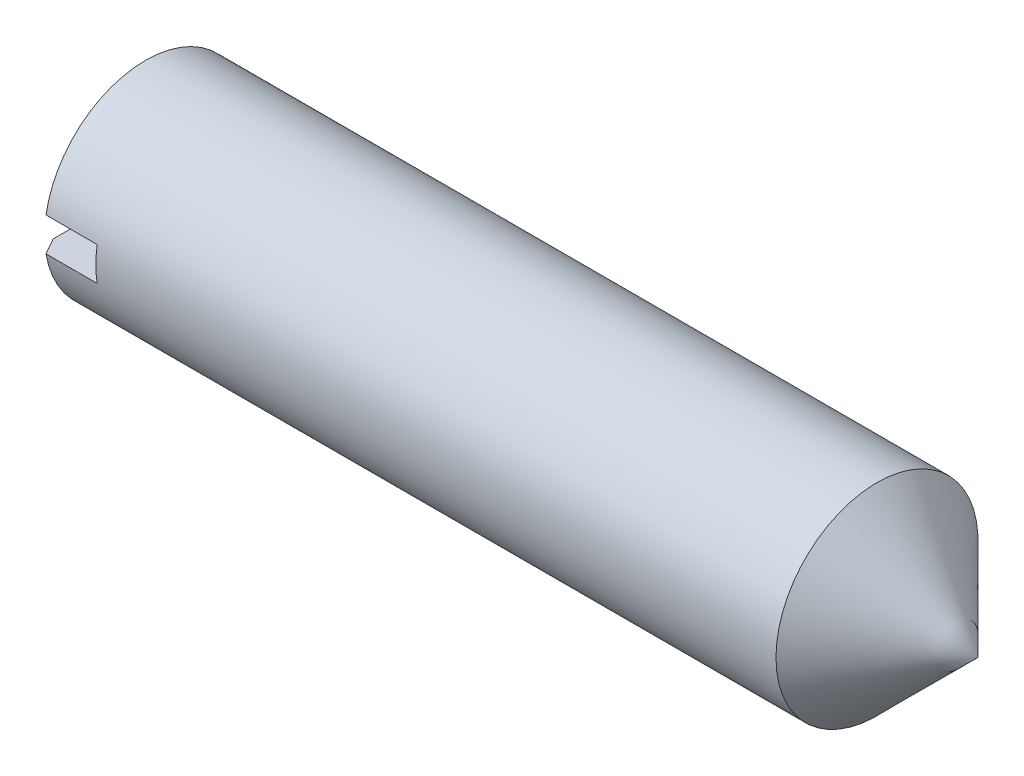
ISO-10303-21;
HEADER;
FILE_DESCRIPTION(('STEP AP214'),'2;1');
FILE_NAME('part.step','',(''),(''),'','','');
FILE_SCHEMA(('AUTOMOTIVE_DESIGN { 1 0 10303 214 1 1 1 1 }'));
ENDSEC;
DATA;
#1=APPLICATION_CONTEXT('core data for automotive mechanical design processes');
#2=APPLICATION_PROTOCOL_DEFINITION('international standard','automotive_design',2000,#1);
#3=PRODUCT_CONTEXT('',#1,'mechanical');
#4=PRODUCT('Part','Part','',(#3));
#5=PRODUCT_RELATED_PRODUCT_CATEGORY('part','',(#4));
#6=PRODUCT_DEFINITION_FORMATION('','',#4);
#7=PRODUCT_DEFINITION_CONTEXT('part definition',#1,'design');
#8=PRODUCT_DEFINITION('design','',#6,#7);
#9=PRODUCT_DEFINITION_SHAPE('','',#8);
#10=(LENGTH_UNIT() NAMED_UNIT(*) SI_UNIT(.MILLI.,.METRE.));
#11=(NAMED_UNIT(*) PLANE_ANGLE_UNIT() SI_UNIT($,.RADIAN.));
#12=(NAMED_UNIT(*) SI_UNIT($,.STERADIAN.) SOLID_ANGLE_UNIT());
#13=UNCERTAINTY_MEASURE_WITH_UNIT(LENGTH_MEASURE(1.E-05),#10,'distance_accuracy_value','');
#14=(GEOMETRIC_REPRESENTATION_CONTEXT(3) GLOBAL_UNCERTAINTY_ASSIGNED_CONTEXT((#13)) GLOBAL_UNIT_ASSIGNED_CONTEXT((#10,
#11,#12)) REPRESENTATION_CONTEXT('',''));
#15=CARTESIAN_POINT('',(0.,0.,0.));
#16=DIRECTION('',(0.,0.,1.));
#17=DIRECTION('',(1.,0.,0.));
#18=AXIS2_PLACEMENT_3D('',#15,#16,#17);
#19=CARTESIAN_POINT('',(0.,0.,0.));
#20=DIRECTION('',(-1.,0.,0.));
#21=DIRECTION('',(0.,0.,1.));
#22=AXIS2_PLACEMENT_3D('',#19,#20,#21);
#23=PLANE('',#22);
#24=CARTESIAN_POINT('',(0.,0.,0.));
#25=DIRECTION('',(-1.,0.,0.));
#26=DIRECTION('',(0.,0.,1.));
#27=AXIS2_PLACEMENT_3D('',#24,#25,#26);
#28=CIRCLE('',#27,5.036);
#29=CARTESIAN_POINT('',(0.,-1.,-4.93571636138058));
#30=VERTEX_POINT('',#29);
#31=CARTESIAN_POINT('',(0.,-0.999999999999999,4.93571636138058));
#32=VERTEX_POINT('',#31);
#33=EDGE_CURVE('E160',#30,#32,#28,.T.);
#34=ORIENTED_EDGE('',*,*,#33,.T.);
#35=DIRECTION('',(0.,0.,-1.));
#36=VECTOR('',#35,1.);
#37=CARTESIAN_POINT('',(0.,-0.999999999999999,6.));
#38=LINE('',#37,#36);
#39=EDGE_CURVE('E114',#32,#30,#38,.T.);
#40=ORIENTED_EDGE('',*,*,#39,.T.);
#41=EDGE_LOOP('',(#34,#40));
#42=FACE_BOUND('',#41,.T.);
#43=ADVANCED_FACE('F35',(#42),#23,.T.);
#44=CARTESIAN_POINT('',(0.,0.,0.));
#45=DIRECTION('',(1.,0.,0.));
#46=DIRECTION('',(0.,0.,-1.));
#47=AXIS2_PLACEMENT_3D('',#44,#45,#46);
#48=CONICAL_SURFACE('',#47,5.036,1.04719755119663);
#49=CARTESIAN_POINT('',(0.556565659498765,0.,0.));
#50=DIRECTION('',(-1.,0.,0.));
#51=DIRECTION('',(0.,0.,1.));
#52=AXIS2_PLACEMENT_3D('',#49,#50,#51);
#53=CIRCLE('',#52,6.);
#54=CARTESIAN_POINT('',(0.556565659498765,-1.,-5.91607978309962));
#55=VERTEX_POINT('',#54);
#56=CARTESIAN_POINT('',(0.556565659498765,-0.999999999999999,5.91607978309962));
#57=VERTEX_POINT('',#56);
#58=EDGE_CURVE('E165',#55,#57,#53,.T.);
#59=ORIENTED_EDGE('',*,*,#58,.T.);
#60=CARTESIAN_POINT('',(4.73989669271483,-0.999999999999998,13.2079399731122));
#61=CARTESIAN_POINT('',(4.41853771720244,-0.999999999999998,12.649708210717));
#62=CARTESIAN_POINT('',(4.09724308620707,-0.999999999999999,12.0914392943507));
#63=CARTESIAN_POINT('',(3.4549186683915,-0.999999999999999,10.9747439104665));
#64=CARTESIAN_POINT('',(3.13388888345024,-0.999999999999999,10.4163174418678));
#65=CARTESIAN_POINT('',(2.49197762047842,-0.999999999999999,9.29878375972739));
#66=CARTESIAN_POINT('',(2.17109646770033,-0.999999999999999,8.73967635935292));
#67=CARTESIAN_POINT('',(1.5300275923409,-0.999999999999999,7.62106803973439));
#68=CARTESIAN_POINT('',(1.20983986573005,-0.999999999999999,7.06156712280223));
#69=CARTESIAN_POINT('',(0.731752999683646,-0.999999999999999,6.22374471344308));
#70=CARTESIAN_POINT('',(0.573331144759489,-0.999999999999999,5.94572157695904));
#71=CARTESIAN_POINT('',(0.257006805730443,-0.999999999999999,5.38937510077954));
#72=CARTESIAN_POINT('',(0.0991043281518022,-0.999999999999999,5.11105175736974));
#73=CARTESIAN_POINT('',(-0.215803871687391,-0.999999999999999,4.55405780901709));
#74=CARTESIAN_POINT('',(-0.372809954009694,-0.999999999999999,4.27538740768412));
#75=CARTESIAN_POINT('',(-0.685421411461987,-0.999999999999999,3.71727146951171));
#76=CARTESIAN_POINT('',(-0.841026834596689,-1.,3.43782595967023));
#77=CARTESIAN_POINT('',(-1.07280047051857,-1.,3.01670739395931));
#78=CARTESIAN_POINT('',(-1.15000341162115,-1.,2.87560489491669));
#79=CARTESIAN_POINT('',(-1.30334590311718,-1.,2.59280771309016));
#80=CARTESIAN_POINT('',(-1.37948536629294,-1.,2.45111298296012));
#81=CARTESIAN_POINT('',(-1.53019389021686,-1.,2.16666998975977));
#82=CARTESIAN_POINT('',(-1.60476099220117,-0.999999999999999,2.02392068095096));
#83=CARTESIAN_POINT('',(-1.71445658720684,-1.,1.80870871103214));
#84=CARTESIAN_POINT('',(-1.75066016319061,-1.,1.73679509885007));
#85=CARTESIAN_POINT('',(-1.82208482318114,-1.,1.59248261773203));
#86=CARTESIAN_POINT('',(-1.85730593731415,-1.,1.52008376376016));
#87=CARTESIAN_POINT('',(-1.92735529771608,-1.,1.37261463948839));
#88=CARTESIAN_POINT('',(-1.96214530553783,-1.,1.29752611216615));
#89=CARTESIAN_POINT('',(-2.02965956084307,-1.,1.14642727351844));
#90=CARTESIAN_POINT('',(-2.06238404828155,-1.,1.07041707049315));
#91=CARTESIAN_POINT('',(-2.12476431844618,-1.,0.917145557122222));
#92=CARTESIAN_POINT('',(-2.15442052211011,-1.,0.839884420078598));
#93=CARTESIAN_POINT('',(-2.20906255805527,-1.,0.683706866903888));
#94=CARTESIAN_POINT('',(-2.23405029456052,-1.,0.604791140337526));
#95=CARTESIAN_POINT('',(-2.27018581045352,-1.,0.470093422561839));
#96=CARTESIAN_POINT('',(-2.28321589300996,-1.,0.414824677608005));
#97=CARTESIAN_POINT('',(-2.3049462303462,-1.,0.303453047162208));
#98=CARTESIAN_POINT('',(-2.31364920633167,-1.,0.247350708818641));
#99=CARTESIAN_POINT('',(-2.32581520982486,-1.,0.13495705990007));
#100=CARTESIAN_POINT('',(-2.32931440889467,-1.,0.0786698056186482));
#101=CARTESIAN_POINT('',(-2.33076867881164,-1.,-0.0339758725520376));
#102=CARTESIAN_POINT('',(-2.32872385654246,-1.,-0.090334295048305));
#103=CARTESIAN_POINT('',(-2.3180579912098,-1.,-0.217768647723007));
#104=CARTESIAN_POINT('',(-2.3078092184783,-1.,-0.288706275864568));
#105=CARTESIAN_POINT('',(-2.280414489516,-1.,-0.429255862703966));
#106=CARTESIAN_POINT('',(-2.2632604858775,-1.,-0.49886617505618));
#107=CARTESIAN_POINT('',(-2.2336732423078,-1.,-0.602653040473396));
#108=CARTESIAN_POINT('',(-2.22308279162327,-1.,-0.637377371820186));
#109=CARTESIAN_POINT('',(-2.20083833270244,-1.,-0.706460987270025));
#110=CARTESIAN_POINT('',(-2.18918499575322,-1.,-0.740820486688082));
#111=CARTESIAN_POINT('',(-2.16499431488904,-1.,-0.809218732225817));
#112=CARTESIAN_POINT('',(-2.15245710212568,-1.,-0.84325752508653));
#113=CARTESIAN_POINT('',(-2.1266433301133,-1.,-0.91105862463122));
#114=CARTESIAN_POINT('',(-2.11336665637896,-1.,-0.944820887568746));
#115=CARTESIAN_POINT('',(-2.06998388355674,-1.,-1.05227293315393));
#116=CARTESIAN_POINT('',(-2.03871498859511,-1.,-1.12549298780915));
#117=CARTESIAN_POINT('',(-1.97418773021559,-1.,-1.27105481935724));
#118=CARTESIAN_POINT('',(-1.94092900538411,-1.,-1.34339643381073));
#119=CARTESIAN_POINT('',(-1.87300145739127,-1.,-1.48745172367406));
#120=CARTESIAN_POINT('',(-1.83833201130238,-1.,-1.55916510431244));
#121=CARTESIAN_POINT('',(-1.76798292469884,-1.,-1.70209571429685));
#122=CARTESIAN_POINT('',(-1.73230324722167,-1.,-1.77331292536984));
#123=CARTESIAN_POINT('',(-1.62404833166045,-1.,-1.98662313537005));
#124=CARTESIAN_POINT('',(-1.55036430564616,-1.,-2.12815237228352));
#125=CARTESIAN_POINT('',(-1.40130813476099,-1.,-2.41025810099429));
#126=CARTESIAN_POINT('',(-1.32593649693932,-1.,-2.55083486286056));
#127=CARTESIAN_POINT('',(-1.17450983157065,-1.,-2.83063597104794));
#128=CARTESIAN_POINT('',(-1.09846071331473,-1.,-2.9698635188263));
#129=CARTESIAN_POINT('',(-0.945628453570271,-1.,-3.24792809661776));
#130=CARTESIAN_POINT('',(-0.868845256726566,-1.,-3.3867650961424));
#131=CARTESIAN_POINT('',(-0.637891315015069,-1.,-3.80258527592336));
#132=CARTESIAN_POINT('',(-0.482967580837516,-1.,-4.07914988721106));
#133=CARTESIAN_POINT('',(-0.119566497031354,-1.,-4.72494312842936));
#134=CARTESIAN_POINT('',(0.0893330443982409,-1.,-5.09393352806221));
#135=CARTESIAN_POINT('',(0.508131169896265,-1.,-5.83135176267693));
#136=CARTESIAN_POINT('',(0.718029765116063,-1.,-6.19977959131851));
#137=CARTESIAN_POINT('',(1.13850339248353,-1.,-6.93645171703563));
#138=CARTESIAN_POINT('',(1.34907866934877,-1.,-7.30469587435077));
#139=CARTESIAN_POINT('',(1.770602232516,-1.,-8.04096877388174));
#140=CARTESIAN_POINT('',(1.98155051744594,-1.,-8.40899751688335));
#141=CARTESIAN_POINT('',(2.40459995529787,-1.,-9.14648067015203));
#142=CARTESIAN_POINT('',(2.61670218630784,-1.,-9.51593446186714));
#143=CARTESIAN_POINT('',(3.04108596616447,-1.,-10.2547396320326));
#144=CARTESIAN_POINT('',(3.2533675152308,-1.,-10.6240910103568));
#145=CARTESIAN_POINT('',(3.67796813526833,-1.,-11.3625576054534));
#146=CARTESIAN_POINT('',(3.89028714937822,-1.,-11.7316728549228));
#147=CARTESIAN_POINT('',(4.31502474467967,-1.,-12.469845406271));
#148=CARTESIAN_POINT('',(4.52744332573721,-1.,-12.8389027082269));
#149=CARTESIAN_POINT('',(4.73989669271483,-1.,-13.2079399731122));
#150=B_SPLINE_CURVE_WITH_KNOTS('',3,(#60,#61,#62,#63,#64,#65,#66,#67,#68,#69,#70,#71,#72,#73,
#74,#75,#76,#77,#78,#79,#80,#81,#82,#83,#84,#85,#86,#87,#88,#89,#90,#91,#92,#93,#94,#95,#96,#97,
#98,#99,#100,#101,#102,#103,#104,#105,#106,#107,#108,#109,#110,#111,#112,#113,#114,#115,#116,
#117,#118,#119,#120,#121,#122,#123,#124,#125,#126,#127,#128,#129,#130,#131,#132,#133,#134,#135,
#136,#137,#138,#139,#140,#141,#142,#143,#144,#145,#146,#147,#148,#149),.UNSPECIFIED.,.F.,.F.,(4,
2,2,2,2,2,2,2,2,2,2,2,2,2,2,2,2,2,2,2,2,2,2,2,2,2,2,2,2,2,2,2,2,2,2,2,2,2,2,2,2,2,2,2,4),(0.,
1.93236881448588,3.86475122217014,5.79868288382638,7.73260327702296,8.69257649447117,
9.652561728751,10.6121295561864,11.5716643702227,12.0541876544273,12.5367502815661,
13.0198822422753,13.2614145867644,13.5029395167376,13.7511887400157,13.9994090704807,
14.247595302324,14.4956800792536,14.6658994442622,14.8360116268792,15.004935737355,
15.1738565911514,15.3884236657496,15.6032415257331,15.7121389898236,15.8209681475887,
15.9297811908746,16.0386111279733,16.2774120534189,16.5162564848272,16.7552075514785,
16.9941673722405,17.4728272005422,17.9513450939761,18.4272722369047,18.9032355559994,
19.8542316736469,21.1262890781179,22.3983607146574,23.6709606308467,24.9435558756872,
26.2215820771649,27.4996098466162,28.7770795475622,30.0545475337865),.UNSPECIFIED.);
#151=EDGE_CURVE('E105',#57,#32,#150,.T.);
#152=ORIENTED_EDGE('',*,*,#151,.T.);
#153=ORIENTED_EDGE('',*,*,#33,.F.);
#154=EDGE_CURVE('E170',#30,#55,#150,.T.);
#155=ORIENTED_EDGE('',*,*,#154,.T.);
#156=EDGE_LOOP('',(#59,#152,#153,#155));
#157=FACE_BOUND('',#156,.T.);
#158=ADVANCED_FACE('F145',(#157),#48,.T.);
#159=CARTESIAN_POINT('',(-12.7,0.,0.));
#160=DIRECTION('',(-1.,0.,0.));
#161=DIRECTION('',(0.,0.,1.));
#162=AXIS2_PLACEMENT_3D('',#159,#160,#161);
#163=CYLINDRICAL_SURFACE('',#162,6.);
#164=CARTESIAN_POINT('',(44.,0.,0.));
#165=DIRECTION('',(-1.,0.,0.));
#166=DIRECTION('',(0.,0.,1.));
#167=AXIS2_PLACEMENT_3D('',#164,#165,#166);
#168=CIRCLE('',#167,6.);
#169=CARTESIAN_POINT('',(44.,0.,6.));
#170=VERTEX_POINT('',#169);
#171=EDGE_CURVE('E169',#170,#170,#168,.T.);
#172=ORIENTED_EDGE('',*,*,#171,.T.);
#173=EDGE_LOOP('',(#172));
#174=FACE_BOUND('',#173,.T.);
#175=ORIENTED_EDGE('',*,*,#58,.F.);
#176=DIRECTION('',(-1.,0.,0.));
#177=VECTOR('',#176,1.);
#178=CARTESIAN_POINT('',(-12.7,-1.,-5.91607978309962));
#179=LINE('',#178,#177);
#180=CARTESIAN_POINT('',(3.6,-1.,-5.91607978309962));
#181=VERTEX_POINT('',#180);
#182=EDGE_CURVE('E12',#55,#181,#179,.F.);
#183=ORIENTED_EDGE('',*,*,#182,.T.);
#184=CARTESIAN_POINT('',(3.6,0.,0.));
#185=DIRECTION('',(-1.,0.,0.));
#186=DIRECTION('',(0.,0.,1.));
#187=AXIS2_PLACEMENT_3D('',#184,#185,#186);
#188=CIRCLE('',#187,6.);
#189=CARTESIAN_POINT('',(3.6,1.,-5.91607978309962));
#190=VERTEX_POINT('',#189);
#191=EDGE_CURVE('E101',#181,#190,#188,.F.);
#192=ORIENTED_EDGE('',*,*,#191,.T.);
#193=DIRECTION('',(-1.,0.,0.));
#194=VECTOR('',#193,1.);
#195=CARTESIAN_POINT('',(-12.7,1.,-5.91607978309962));
#196=LINE('',#195,#194);
#197=CARTESIAN_POINT('',(0.556565659498765,1.,-5.91607978309962));
#198=VERTEX_POINT('',#197);
#199=EDGE_CURVE('E43',#198,#190,#196,.F.);
#200=ORIENTED_EDGE('',*,*,#199,.F.);
#201=CARTESIAN_POINT('',(0.556565659498765,1.,5.91607978309962));
#202=VERTEX_POINT('',#201);
#203=EDGE_CURVE('E161',#202,#198,#53,.T.);
#204=ORIENTED_EDGE('',*,*,#203,.F.);
#205=DIRECTION('',(-1.,0.,0.));
#206=VECTOR('',#205,1.);
#207=CARTESIAN_POINT('',(-12.7,1.,5.91607978309962));
#208=LINE('',#207,#206);
#209=CARTESIAN_POINT('',(3.6,1.,5.91607978309962));
#210=VERTEX_POINT('',#209);
#211=EDGE_CURVE('E94',#210,#202,#208,.T.);
#212=ORIENTED_EDGE('',*,*,#211,.F.);
#213=CARTESIAN_POINT('',(3.6,-0.999999999999999,5.91607978309962));
#214=VERTEX_POINT('',#213);
#215=EDGE_CURVE('E87',#210,#214,#188,.F.);
#216=ORIENTED_EDGE('',*,*,#215,.T.);
#217=DIRECTION('',(-1.,0.,0.));
#218=VECTOR('',#217,1.);
#219=CARTESIAN_POINT('',(-12.7,-0.999999999999999,5.91607978309962));
#220=LINE('',#219,#218);
#221=EDGE_CURVE('E91',#214,#57,#220,.T.);
#222=ORIENTED_EDGE('',*,*,#221,.T.);
#223=EDGE_LOOP('',(#175,#183,#192,#200,#204,#212,#216,#222));
#224=FACE_BOUND('',#223,.T.);
#225=ADVANCED_FACE('F90',(#174,#224),#163,.T.);
#226=DIRECTION('',(0.,0.,-1.));
#227=VECTOR('',#226,1.);
#228=CARTESIAN_POINT('',(0.,1.,6.));
#229=LINE('',#228,#227);
#230=CARTESIAN_POINT('',(0.,1.,4.93571636138058));
#231=VERTEX_POINT('',#230);
#232=CARTESIAN_POINT('',(0.,1.,-4.93571636138058));
#233=VERTEX_POINT('',#232);
#234=EDGE_CURVE('E117',#231,#233,#229,.T.);
#235=ORIENTED_EDGE('',*,*,#234,.F.);
#236=EDGE_CURVE('E99',#231,#233,#28,.T.);
#237=ORIENTED_EDGE('',*,*,#236,.T.);
#238=EDGE_LOOP('',(#235,#237));
#239=FACE_BOUND('',#238,.T.);
#240=ADVANCED_FACE('F37',(#239),#23,.T.);
#241=CARTESIAN_POINT('',(4.73989669271483,1.,13.2079399731122));
#242=CARTESIAN_POINT('',(4.41853771720244,1.,12.649708210717));
#243=CARTESIAN_POINT('',(4.09724308620707,1.,12.0914392943507));
#244=CARTESIAN_POINT('',(3.4549186683915,1.,10.9747439104665));
#245=CARTESIAN_POINT('',(3.13388888345024,1.,10.4163174418678));
#246=CARTESIAN_POINT('',(2.49197762047842,1.,9.29878375972739));
#247=CARTESIAN_POINT('',(2.17109646770033,1.,8.73967635935292));
#248=CARTESIAN_POINT('',(1.5300275923409,1.,7.62106803973439));
#249=CARTESIAN_POINT('',(1.20983986573005,1.,7.06156712280223));
#250=CARTESIAN_POINT('',(0.731752999683645,1.,6.22374471344308));
#251=CARTESIAN_POINT('',(0.573331144759488,1.,5.94572157695904));
#252=CARTESIAN_POINT('',(0.257006805730442,1.,5.38937510077954));
#253=CARTESIAN_POINT('',(0.0991043281518012,1.,5.11105175736974));
#254=CARTESIAN_POINT('',(-0.215803871687393,1.,4.55405780901709));
#255=CARTESIAN_POINT('',(-0.372809954009695,1.,4.27538740768411));
#256=CARTESIAN_POINT('',(-0.685421411461988,1.,3.7172714695117));
#257=CARTESIAN_POINT('',(-0.841026834596691,1.,3.43782595967023));
#258=CARTESIAN_POINT('',(-1.07280047051857,1.,3.01670739395931));
#259=CARTESIAN_POINT('',(-1.15000341162115,1.,2.87560489491669));
#260=CARTESIAN_POINT('',(-1.30334590311718,1.,2.59280771309016));
#261=CARTESIAN_POINT('',(-1.37948536629294,1.,2.45111298296012));
#262=CARTESIAN_POINT('',(-1.53019389021686,1.,2.16666998975977));
#263=CARTESIAN_POINT('',(-1.60476099220117,1.,2.02392068095095));
#264=CARTESIAN_POINT('',(-1.71445658720685,1.,1.80870871103214));
#265=CARTESIAN_POINT('',(-1.75066016319061,1.,1.73679509885006));
#266=CARTESIAN_POINT('',(-1.82208482318115,1.,1.59248261773203));
#267=CARTESIAN_POINT('',(-1.85730593731415,1.,1.52008376376016));
#268=CARTESIAN_POINT('',(-1.92735529771608,1.,1.37261463948839));
#269=CARTESIAN_POINT('',(-1.96214530553783,1.,1.29752611216615));
#270=CARTESIAN_POINT('',(-2.02965956084307,1.,1.14642727351844));
#271=CARTESIAN_POINT('',(-2.06238404828155,1.,1.07041707049315));
#272=CARTESIAN_POINT('',(-2.12476431844618,1.,0.917145557122221));
#273=CARTESIAN_POINT('',(-2.15442052211011,1.,0.839884420078597));
#274=CARTESIAN_POINT('',(-2.20906255805527,1.,0.683706866903886));
#275=CARTESIAN_POINT('',(-2.23405029456052,1.,0.604791140337524));
#276=CARTESIAN_POINT('',(-2.27018581045352,1.,0.470093422561838));
#277=CARTESIAN_POINT('',(-2.28321589300996,1.,0.414824677608004));
#278=CARTESIAN_POINT('',(-2.3049462303462,1.,0.303453047162207));
#279=CARTESIAN_POINT('',(-2.31364920633167,1.,0.24735070881864));
#280=CARTESIAN_POINT('',(-2.32581520982486,1.,0.134957059900069));
#281=CARTESIAN_POINT('',(-2.32931440889467,1.,0.0786698056186469));
#282=CARTESIAN_POINT('',(-2.33076867881164,1.,-0.0339758725520388));
#283=CARTESIAN_POINT('',(-2.32872385654246,1.,-0.0903342950483062));
#284=CARTESIAN_POINT('',(-2.3180579912098,1.,-0.217768647723008));
#285=CARTESIAN_POINT('',(-2.3078092184783,1.,-0.288706275864569));
#286=CARTESIAN_POINT('',(-2.280414489516,1.,-0.429255862703967));
#287=CARTESIAN_POINT('',(-2.2632604858775,1.,-0.498866175056181));
#288=CARTESIAN_POINT('',(-2.2336732423078,1.,-0.602653040473397));
#289=CARTESIAN_POINT('',(-2.22308279162327,1.,-0.637377371820187));
#290=CARTESIAN_POINT('',(-2.20083833270244,1.,-0.706460987270026));
#291=CARTESIAN_POINT('',(-2.18918499575322,1.,-0.740820486688084));
#292=CARTESIAN_POINT('',(-2.16499431488904,1.,-0.809218732225819));
#293=CARTESIAN_POINT('',(-2.15245710212568,1.,-0.843257525086532));
#294=CARTESIAN_POINT('',(-2.1266433301133,1.,-0.911058624631222));
#295=CARTESIAN_POINT('',(-2.11336665637896,1.,-0.944820887568748));
#296=CARTESIAN_POINT('',(-2.06998388355674,1.,-1.05227293315393));
#297=CARTESIAN_POINT('',(-2.03871498859511,1.,-1.12549298780916));
#298=CARTESIAN_POINT('',(-1.97418773021559,1.,-1.27105481935724));
#299=CARTESIAN_POINT('',(-1.94092900538411,1.,-1.34339643381073));
#300=CARTESIAN_POINT('',(-1.87300145739127,1.,-1.48745172367406));
#301=CARTESIAN_POINT('',(-1.83833201130238,1.,-1.55916510431244));
#302=CARTESIAN_POINT('',(-1.76798292469884,1.,-1.70209571429685));
#303=CARTESIAN_POINT('',(-1.73230324722167,1.,-1.77331292536984));
#304=CARTESIAN_POINT('',(-1.62404833166045,1.,-1.98662313537006));
#305=CARTESIAN_POINT('',(-1.55036430564615,1.,-2.12815237228353));
#306=CARTESIAN_POINT('',(-1.40130813476098,1.,-2.4102581009943));
#307=CARTESIAN_POINT('',(-1.32593649693932,1.,-2.55083486286057));
#308=CARTESIAN_POINT('',(-1.17450983157065,1.,-2.83063597104795));
#309=CARTESIAN_POINT('',(-1.09846071331473,1.,-2.9698635188263));
#310=CARTESIAN_POINT('',(-0.945628453570267,1.,-3.24792809661776));
#311=CARTESIAN_POINT('',(-0.868845256726562,1.,-3.38676509614241));
#312=CARTESIAN_POINT('',(-0.637891315015066,1.,-3.80258527592337));
#313=CARTESIAN_POINT('',(-0.482967580837512,1.,-4.07914988721106));
#314=CARTESIAN_POINT('',(-0.11956649703135,1.,-4.72494312842937));
#315=CARTESIAN_POINT('',(0.0893330443982452,1.,-5.09393352806222));
#316=CARTESIAN_POINT('',(0.508131169896269,1.,-5.83135176267694));
#317=CARTESIAN_POINT('',(0.718029765116066,1.,-6.19977959131852));
#318=CARTESIAN_POINT('',(1.13850339248353,1.,-6.93645171703564));
#319=CARTESIAN_POINT('',(1.34907866934877,0.999999999999999,-7.30469587435077));
#320=CARTESIAN_POINT('',(1.770602232516,0.999999999999999,-8.04096877388175));
#321=CARTESIAN_POINT('',(1.98155051744595,0.999999999999999,-8.40899751688335));
#322=CARTESIAN_POINT('',(2.40459995529787,0.999999999999999,-9.14648067015204));
#323=CARTESIAN_POINT('',(2.61670218630784,0.999999999999999,-9.51593446186714));
#324=CARTESIAN_POINT('',(3.04108596616447,0.999999999999999,-10.2547396320326));
#325=CARTESIAN_POINT('',(3.25336751523081,0.999999999999999,-10.6240910103568));
#326=CARTESIAN_POINT('',(3.67796813526834,0.999999999999999,-11.3625576054534));
#327=CARTESIAN_POINT('',(3.89028714937822,0.999999999999999,-11.7316728549228));
#328=CARTESIAN_POINT('',(4.31502474467967,0.999999999999999,-12.469845406271));
#329=CARTESIAN_POINT('',(4.52744332573721,0.999999999999999,-12.8389027082269));
#330=CARTESIAN_POINT('',(4.73989669271483,0.999999999999999,-13.2079399731122));
#331=B_SPLINE_CURVE_WITH_KNOTS('',3,(#241,#242,#243,#244,#245,#246,#247,#248,#249,#250,#251,
#252,#253,#254,#255,#256,#257,#258,#259,#260,#261,#262,#263,#264,#265,#266,#267,#268,#269,#270,
#271,#272,#273,#274,#275,#276,#277,#278,#279,#280,#281,#282,#283,#284,#285,#286,#287,#288,#289,
#290,#291,#292,#293,#294,#295,#296,#297,#298,#299,#300,#301,#302,#303,#304,#305,#306,#307,#308,
#309,#310,#311,#312,#313,#314,#315,#316,#317,#318,#319,#320,#321,#322,#323,#324,#325,#326,#327,
#328,#329,#330),.UNSPECIFIED.,.F.,.F.,(4,2,2,2,2,2,2,2,2,2,2,2,2,2,2,2,2,2,2,2,2,2,2,2,2,2,2,2,
2,2,2,2,2,2,2,2,2,2,2,2,2,2,2,2,4),(0.,1.93236881448588,3.86475122217014,5.79868288382638,
7.73260327702296,8.69257649447118,9.65256172875101,10.6121295561864,11.5716643702227,
12.0541876544273,12.5367502815661,13.0198822422753,13.2614145867644,13.5029395167376,
13.7511887400157,13.9994090704807,14.247595302324,14.4956800792536,14.6658994442622,
14.8360116268792,15.004935737355,15.1738565911514,15.3884236657496,15.6032415257331,
15.7121389898236,15.8209681475887,15.9297811908746,16.0386111279733,16.2774120534189,
16.5162564848272,16.7552075514785,16.9941673722405,17.4728272005422,17.9513450939761,
18.4272722369047,18.9032355559994,19.854231673647,21.1262890781179,22.3983607146574,
23.6709606308467,24.9435558756872,26.2215820771649,27.4996098466162,28.7770795475622,
30.0545475337865),.UNSPECIFIED.);
#332=EDGE_CURVE('E109',#202,#231,#331,.T.);
#333=ORIENTED_EDGE('',*,*,#332,.F.);
#334=ORIENTED_EDGE('',*,*,#203,.T.);
#335=EDGE_CURVE('E112',#233,#198,#331,.T.);
#336=ORIENTED_EDGE('',*,*,#335,.F.);
#337=ORIENTED_EDGE('',*,*,#236,.F.);
#338=EDGE_LOOP('',(#333,#334,#336,#337));
#339=FACE_BOUND('',#338,.T.);
#340=ADVANCED_FACE('F132',(#339),#48,.T.);
#341=CARTESIAN_POINT('',(44.,0.,0.));
#342=DIRECTION('',(-1.,0.,0.));
#343=DIRECTION('',(0.,0.,1.));
#344=AXIS2_PLACEMENT_3D('',#341,#342,#343);
#345=CONICAL_SURFACE('',#344,6.,0.785398163397453);
#346=CARTESIAN_POINT('',(50.,0.,0.));
#347=VERTEX_POINT('',#346);
#348=VERTEX_LOOP('',#347);
#349=FACE_BOUND('',#348,.T.);
#350=ORIENTED_EDGE('',*,*,#171,.F.);
#351=EDGE_LOOP('',(#350));
#352=FACE_BOUND('',#351,.T.);
#353=ADVANCED_FACE('F142',(#349,#352),#345,.T.);
#354=CARTESIAN_POINT('',(3.6,-0.999999999999999,6.));
#355=DIRECTION('',(0.,1.,0.));
#356=DIRECTION('',(0.,0.,1.));
#357=AXIS2_PLACEMENT_3D('',#354,#355,#356);
#358=PLANE('',#357);
#359=ORIENTED_EDGE('',*,*,#39,.F.);
#360=ORIENTED_EDGE('',*,*,#151,.F.);
#361=ORIENTED_EDGE('',*,*,#221,.F.);
#362=DIRECTION('',(0.,0.,-1.));
#363=VECTOR('',#362,1.);
#364=CARTESIAN_POINT('',(3.6,-0.999999999999999,6.));
#365=LINE('',#364,#363);
#366=EDGE_CURVE('E103',#214,#181,#365,.T.);
#367=ORIENTED_EDGE('',*,*,#366,.T.);
#368=ORIENTED_EDGE('',*,*,#182,.F.);
#369=ORIENTED_EDGE('',*,*,#154,.F.);
#370=EDGE_LOOP('',(#359,#360,#361,#367,#368,#369));
#371=FACE_BOUND('',#370,.T.);
#372=ADVANCED_FACE('F102',(#371),#358,.T.);
#373=CARTESIAN_POINT('',(3.6,1.,6.));
#374=DIRECTION('',(0.,1.,0.));
#375=DIRECTION('',(0.,0.,1.));
#376=AXIS2_PLACEMENT_3D('',#373,#374,#375);
#377=PLANE('',#376);
#378=ORIENTED_EDGE('',*,*,#335,.T.);
#379=ORIENTED_EDGE('',*,*,#199,.T.);
#380=DIRECTION('',(0.,0.,-1.));
#381=VECTOR('',#380,1.);
#382=CARTESIAN_POINT('',(3.6,1.,6.));
#383=LINE('',#382,#381);
#384=EDGE_CURVE('E110',#210,#190,#383,.T.);
#385=ORIENTED_EDGE('',*,*,#384,.F.);
#386=ORIENTED_EDGE('',*,*,#211,.T.);
#387=ORIENTED_EDGE('',*,*,#332,.T.);
#388=ORIENTED_EDGE('',*,*,#234,.T.);
#389=EDGE_LOOP('',(#378,#379,#385,#386,#387,#388));
#390=FACE_BOUND('',#389,.T.);
#391=ADVANCED_FACE('F135',(#390),#377,.F.);
#392=CARTESIAN_POINT('',(3.6,1.,6.));
#393=DIRECTION('',(-1.,0.,0.));
#394=DIRECTION('',(0.,0.,1.));
#395=AXIS2_PLACEMENT_3D('',#392,#393,#394);
#396=PLANE('',#395);
#397=ORIENTED_EDGE('',*,*,#366,.F.);
#398=ORIENTED_EDGE('',*,*,#215,.F.);
#399=ORIENTED_EDGE('',*,*,#384,.T.);
#400=ORIENTED_EDGE('',*,*,#191,.F.);
#401=EDGE_LOOP('',(#397,#398,#399,#400));
#402=FACE_BOUND('',#401,.T.);
#403=ADVANCED_FACE('F107',(#402),#396,.T.);
#404=CLOSED_SHELL('',(#43,#158,#225,#240,#340,#353,#372,#391,#403));
#405=MANIFOLD_SOLID_BREP('B2',#404);
#406=ADVANCED_BREP_SHAPE_REPRESENTATION('',(#18,#405),#14);
#407=SHAPE_DEFINITION_REPRESENTATION(#9,#406);
ENDSEC;
END-ISO-10303-21;
